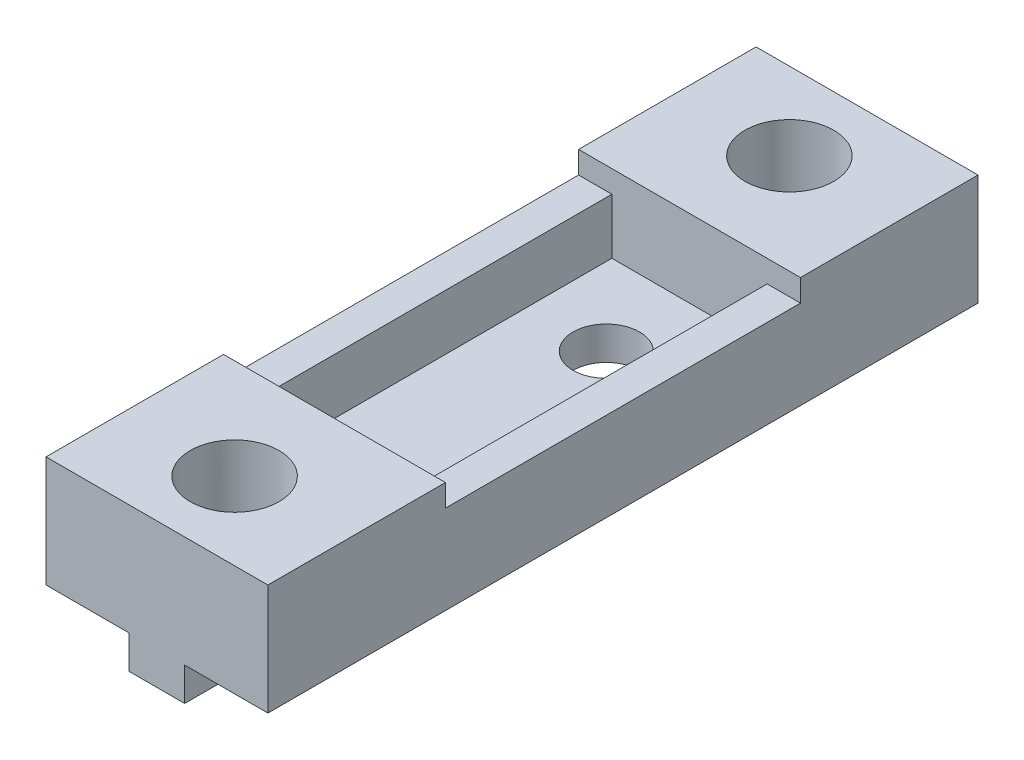
ISO-10303-21;
HEADER;
FILE_DESCRIPTION(('STEP AP214'),'2;1');
FILE_NAME('part.step','',(''),(''),'','','');
FILE_SCHEMA(('AUTOMOTIVE_DESIGN { 1 0 10303 214 1 1 1 1 }'));
ENDSEC;
DATA;
#1=APPLICATION_CONTEXT('core data for automotive mechanical design processes');
#2=APPLICATION_PROTOCOL_DEFINITION('international standard','automotive_design',2000,#1);
#3=PRODUCT_CONTEXT('',#1,'mechanical');
#4=PRODUCT('Part','Part','',(#3));
#5=PRODUCT_RELATED_PRODUCT_CATEGORY('part','',(#4));
#6=PRODUCT_DEFINITION_FORMATION('','',#4);
#7=PRODUCT_DEFINITION_CONTEXT('part definition',#1,'design');
#8=PRODUCT_DEFINITION('design','',#6,#7);
#9=PRODUCT_DEFINITION_SHAPE('','',#8);
#10=(LENGTH_UNIT() NAMED_UNIT(*) SI_UNIT(.MILLI.,.METRE.));
#11=(NAMED_UNIT(*) PLANE_ANGLE_UNIT() SI_UNIT($,.RADIAN.));
#12=(NAMED_UNIT(*) SI_UNIT($,.STERADIAN.) SOLID_ANGLE_UNIT());
#13=UNCERTAINTY_MEASURE_WITH_UNIT(LENGTH_MEASURE(1.E-05),#10,'distance_accuracy_value','');
#14=(GEOMETRIC_REPRESENTATION_CONTEXT(3) GLOBAL_UNCERTAINTY_ASSIGNED_CONTEXT((#13)) GLOBAL_UNIT_ASSIGNED_CONTEXT((#10,
#11,#12)) REPRESENTATION_CONTEXT('',''));
#15=CARTESIAN_POINT('',(0.,0.,0.));
#16=DIRECTION('',(0.,0.,1.));
#17=DIRECTION('',(1.,0.,0.));
#18=AXIS2_PLACEMENT_3D('',#15,#16,#17);
#19=CARTESIAN_POINT('',(0.,3.,0.));
#20=DIRECTION('',(0.,-1.,0.));
#21=DIRECTION('',(0.,0.,-1.));
#22=AXIS2_PLACEMENT_3D('',#19,#20,#21);
#23=PLANE('',#22);
#24=CARTESIAN_POINT('',(0.,3.,8.5));
#25=DIRECTION('',(0.,-1.,0.));
#26=DIRECTION('',(0.,0.,-1.));
#27=AXIS2_PLACEMENT_3D('',#24,#25,#26);
#28=CIRCLE('',#27,3.);
#29=CARTESIAN_POINT('',(0.,3.,5.5));
#30=VERTEX_POINT('',#29);
#31=EDGE_CURVE('E356',#30,#30,#28,.T.);
#32=ORIENTED_EDGE('',*,*,#31,.T.);
#33=EDGE_LOOP('',(#32));
#34=FACE_BOUND('',#33,.T.);
#35=DIRECTION('',(0.,0.,-1.));
#36=VECTOR('',#35,1.);
#37=CARTESIAN_POINT('',(-7.,3.,0.));
#38=LINE('',#37,#36);
#39=CARTESIAN_POINT('',(-7.,3.,33.));
#40=VERTEX_POINT('',#39);
#41=CARTESIAN_POINT('',(-7.,3.,0.999999999999997));
#42=VERTEX_POINT('',#41);
#43=EDGE_CURVE('E204',#40,#42,#38,.T.);
#44=ORIENTED_EDGE('',*,*,#43,.F.);
#45=DIRECTION('',(1.,0.,0.));
#46=VECTOR('',#45,1.);
#47=CARTESIAN_POINT('',(0.,3.,33.));
#48=LINE('',#47,#46);
#49=CARTESIAN_POINT('',(7.,3.,33.));
#50=VERTEX_POINT('',#49);
#51=EDGE_CURVE('E186',#40,#50,#48,.T.);
#52=ORIENTED_EDGE('',*,*,#51,.T.);
#53=DIRECTION('',(0.,0.,-1.));
#54=VECTOR('',#53,1.);
#55=CARTESIAN_POINT('',(7.,3.,0.));
#56=LINE('',#55,#54);
#57=CARTESIAN_POINT('',(7.,3.,0.999999999999997));
#58=VERTEX_POINT('',#57);
#59=EDGE_CURVE('E190',#50,#58,#56,.T.);
#60=ORIENTED_EDGE('',*,*,#59,.T.);
#61=DIRECTION('',(1.,0.,0.));
#62=VECTOR('',#61,1.);
#63=CARTESIAN_POINT('',(0.,3.,0.999999999999997));
#64=LINE('',#63,#62);
#65=EDGE_CURVE('E332',#42,#58,#64,.T.);
#66=ORIENTED_EDGE('',*,*,#65,.F.);
#67=EDGE_LOOP('',(#44,#52,#60,#66));
#68=FACE_BOUND('',#67,.T.);
#69=ADVANCED_FACE('F41',(#34,#68),#23,.F.);
#70=CARTESIAN_POINT('',(0.,35.6124969497314,0.999999999999997));
#71=DIRECTION('',(0.,0.,-1.));
#72=DIRECTION('',(-1.,0.,0.));
#73=AXIS2_PLACEMENT_3D('',#70,#71,#72);
#74=PLANE('',#73);
#75=DIRECTION('',(0.,-1.,0.));
#76=VECTOR('',#75,1.);
#77=CARTESIAN_POINT('',(-7.,8.,0.999999999999997));
#78=LINE('',#77,#76);
#79=CARTESIAN_POINT('',(-7.,8.,0.999999999999997));
#80=VERTEX_POINT('',#79);
#81=EDGE_CURVE('E191',#80,#42,#78,.T.);
#82=ORIENTED_EDGE('',*,*,#81,.T.);
#83=ORIENTED_EDGE('',*,*,#65,.T.);
#84=DIRECTION('',(0.,-1.,0.));
#85=VECTOR('',#84,1.);
#86=CARTESIAN_POINT('',(7.,8.,0.999999999999997));
#87=LINE('',#86,#85);
#88=CARTESIAN_POINT('',(7.,8.,0.999999999999997));
#89=VERTEX_POINT('',#88);
#90=EDGE_CURVE('E231',#89,#58,#87,.T.);
#91=ORIENTED_EDGE('',*,*,#90,.F.);
#92=DIRECTION('',(-1.,0.,0.));
#93=VECTOR('',#92,1.);
#94=CARTESIAN_POINT('',(0.,8.,0.999999999999997));
#95=LINE('',#94,#93);
#96=CARTESIAN_POINT('',(10.,8.,0.999999999999997));
#97=VERTEX_POINT('',#96);
#98=EDGE_CURVE('E227',#97,#89,#95,.T.);
#99=ORIENTED_EDGE('',*,*,#98,.F.);
#100=DIRECTION('',(0.,-1.,0.));
#101=VECTOR('',#100,1.);
#102=CARTESIAN_POINT('',(10.,35.6124969497314,0.999999999999997));
#103=LINE('',#102,#101);
#104=CARTESIAN_POINT('',(10.,10.,0.999999999999997));
#105=VERTEX_POINT('',#104);
#106=EDGE_CURVE('E331',#105,#97,#103,.T.);
#107=ORIENTED_EDGE('',*,*,#106,.F.);
#108=DIRECTION('',(1.,0.,0.));
#109=VECTOR('',#108,1.);
#110=CARTESIAN_POINT('',(0.,10.,0.999999999999997));
#111=LINE('',#110,#109);
#112=CARTESIAN_POINT('',(-10.,10.,0.999999999999997));
#113=VERTEX_POINT('',#112);
#114=EDGE_CURVE('E335',#113,#105,#111,.T.);
#115=ORIENTED_EDGE('',*,*,#114,.F.);
#116=DIRECTION('',(0.,-1.,0.));
#117=VECTOR('',#116,1.);
#118=CARTESIAN_POINT('',(-10.,35.6124969497314,0.999999999999997));
#119=LINE('',#118,#117);
#120=CARTESIAN_POINT('',(-10.,8.,0.999999999999997));
#121=VERTEX_POINT('',#120);
#122=EDGE_CURVE('E63',#113,#121,#119,.T.);
#123=ORIENTED_EDGE('',*,*,#122,.T.);
#124=DIRECTION('',(-1.,0.,0.));
#125=VECTOR('',#124,1.);
#126=CARTESIAN_POINT('',(0.,8.,0.999999999999997));
#127=LINE('',#126,#125);
#128=EDGE_CURVE('E58',#80,#121,#127,.T.);
#129=ORIENTED_EDGE('',*,*,#128,.F.);
#130=EDGE_LOOP('',(#82,#83,#91,#99,#107,#115,#123,#129));
#131=FACE_BOUND('',#130,.T.);
#132=ADVANCED_FACE('F476',(#131),#74,.F.);
#133=CARTESIAN_POINT('',(0.,35.6124969497314,33.));
#134=DIRECTION('',(0.,0.,-1.));
#135=DIRECTION('',(-1.,0.,0.));
#136=AXIS2_PLACEMENT_3D('',#133,#134,#135);
#137=PLANE('',#136);
#138=ORIENTED_EDGE('',*,*,#51,.F.);
#139=DIRECTION('',(0.,-1.,0.));
#140=VECTOR('',#139,1.);
#141=CARTESIAN_POINT('',(-7.,8.,33.));
#142=LINE('',#141,#140);
#143=CARTESIAN_POINT('',(-7.,8.,33.));
#144=VERTEX_POINT('',#143);
#145=EDGE_CURVE('E178',#144,#40,#142,.T.);
#146=ORIENTED_EDGE('',*,*,#145,.F.);
#147=DIRECTION('',(1.,0.,0.));
#148=VECTOR('',#147,1.);
#149=CARTESIAN_POINT('',(0.,8.,33.));
#150=LINE('',#149,#148);
#151=CARTESIAN_POINT('',(-10.,8.,33.));
#152=VERTEX_POINT('',#151);
#153=EDGE_CURVE('E183',#152,#144,#150,.T.);
#154=ORIENTED_EDGE('',*,*,#153,.F.);
#155=DIRECTION('',(0.,-1.,0.));
#156=VECTOR('',#155,1.);
#157=CARTESIAN_POINT('',(-10.,35.6124969497314,33.));
#158=LINE('',#157,#156);
#159=CARTESIAN_POINT('',(-10.,10.,33.));
#160=VERTEX_POINT('',#159);
#161=EDGE_CURVE('E279',#160,#152,#158,.T.);
#162=ORIENTED_EDGE('',*,*,#161,.F.);
#163=DIRECTION('',(1.,0.,0.));
#164=VECTOR('',#163,1.);
#165=CARTESIAN_POINT('',(0.,10.,33.));
#166=LINE('',#165,#164);
#167=CARTESIAN_POINT('',(10.,10.,33.));
#168=VERTEX_POINT('',#167);
#169=EDGE_CURVE('E269',#160,#168,#166,.T.);
#170=ORIENTED_EDGE('',*,*,#169,.T.);
#171=DIRECTION('',(0.,-1.,0.));
#172=VECTOR('',#171,1.);
#173=CARTESIAN_POINT('',(10.,35.6124969497314,33.));
#174=LINE('',#173,#172);
#175=CARTESIAN_POINT('',(10.,8.,33.));
#176=VERTEX_POINT('',#175);
#177=EDGE_CURVE('E282',#168,#176,#174,.T.);
#178=ORIENTED_EDGE('',*,*,#177,.T.);
#179=DIRECTION('',(1.,0.,0.));
#180=VECTOR('',#179,1.);
#181=CARTESIAN_POINT('',(0.,8.,33.));
#182=LINE('',#181,#180);
#183=CARTESIAN_POINT('',(7.,8.,33.));
#184=VERTEX_POINT('',#183);
#185=EDGE_CURVE('E219',#184,#176,#182,.T.);
#186=ORIENTED_EDGE('',*,*,#185,.F.);
#187=DIRECTION('',(0.,-1.,0.));
#188=VECTOR('',#187,1.);
#189=CARTESIAN_POINT('',(7.,8.,33.));
#190=LINE('',#189,#188);
#191=EDGE_CURVE('E238',#184,#50,#190,.T.);
#192=ORIENTED_EDGE('',*,*,#191,.T.);
#193=EDGE_LOOP('',(#138,#146,#154,#162,#170,#178,#186,#192));
#194=FACE_BOUND('',#193,.T.);
#195=ADVANCED_FACE('F180',(#194),#137,.T.);
#196=CARTESIAN_POINT('',(0.,0.,0.));
#197=DIRECTION('',(0.,-1.,0.));
#198=DIRECTION('',(0.,0.,-1.));
#199=AXIS2_PLACEMENT_3D('',#196,#197,#198);
#200=PLANE('',#199);
#201=CARTESIAN_POINT('',(0.,0.,8.5));
#202=DIRECTION('',(0.,-1.,0.));
#203=DIRECTION('',(0.,0.,-1.));
#204=AXIS2_PLACEMENT_3D('',#201,#202,#203);
#205=CIRCLE('',#204,3.);
#206=CARTESIAN_POINT('',(0.,0.,5.5));
#207=VERTEX_POINT('',#206);
#208=EDGE_CURVE('E45',#207,#207,#205,.T.);
#209=ORIENTED_EDGE('',*,*,#208,.F.);
#210=EDGE_LOOP('',(#209));
#211=FACE_BOUND('',#210,.T.);
#212=DIRECTION('',(1.,0.,0.));
#213=VECTOR('',#212,1.);
#214=CARTESIAN_POINT('',(-2.5,0.,25.));
#215=LINE('',#214,#213);
#216=CARTESIAN_POINT('',(-2.5,0.,25.));
#217=VERTEX_POINT('',#216);
#218=CARTESIAN_POINT('',(2.5,0.,25.));
#219=VERTEX_POINT('',#218);
#220=EDGE_CURVE('E253',#217,#219,#215,.T.);
#221=ORIENTED_EDGE('',*,*,#220,.F.);
#222=DIRECTION('',(0.,0.,1.));
#223=VECTOR('',#222,1.);
#224=CARTESIAN_POINT('',(-2.5,0.,49.));
#225=LINE('',#224,#223);
#226=CARTESIAN_POINT('',(-2.5,0.,49.));
#227=VERTEX_POINT('',#226);
#228=EDGE_CURVE('E298',#217,#227,#225,.T.);
#229=ORIENTED_EDGE('',*,*,#228,.T.);
#230=DIRECTION('',(-1.,0.,0.));
#231=VECTOR('',#230,1.);
#232=CARTESIAN_POINT('',(-10.,0.,49.));
#233=LINE('',#232,#231);
#234=CARTESIAN_POINT('',(-10.,0.,49.));
#235=VERTEX_POINT('',#234);
#236=EDGE_CURVE('E319',#227,#235,#233,.T.);
#237=ORIENTED_EDGE('',*,*,#236,.T.);
#238=DIRECTION('',(0.,0.,1.));
#239=VECTOR('',#238,1.);
#240=CARTESIAN_POINT('',(-10.,0.,15.));
#241=LINE('',#240,#239);
#242=CARTESIAN_POINT('',(-10.,0.,-15.));
#243=VERTEX_POINT('',#242);
#244=EDGE_CURVE('E413',#243,#235,#241,.T.);
#245=ORIENTED_EDGE('',*,*,#244,.F.);
#246=DIRECTION('',(-1.,0.,0.));
#247=VECTOR('',#246,1.);
#248=CARTESIAN_POINT('',(-10.,0.,-15.));
#249=LINE('',#248,#247);
#250=CARTESIAN_POINT('',(-2.5,0.,-15.));
#251=VERTEX_POINT('',#250);
#252=EDGE_CURVE('E408',#251,#243,#249,.T.);
#253=ORIENTED_EDGE('',*,*,#252,.F.);
#254=DIRECTION('',(0.,0.,-1.));
#255=VECTOR('',#254,1.);
#256=CARTESIAN_POINT('',(-2.5,0.,-15.));
#257=LINE('',#256,#255);
#258=CARTESIAN_POINT('',(-2.5,0.,-3.));
#259=VERTEX_POINT('',#258);
#260=EDGE_CURVE('E370',#259,#251,#257,.T.);
#261=ORIENTED_EDGE('',*,*,#260,.F.);
#262=DIRECTION('',(-1.,0.,0.));
#263=VECTOR('',#262,1.);
#264=CARTESIAN_POINT('',(-2.5,0.,-3.));
#265=LINE('',#264,#263);
#266=CARTESIAN_POINT('',(2.5,0.,-3.));
#267=VERTEX_POINT('',#266);
#268=EDGE_CURVE('E383',#267,#259,#265,.T.);
#269=ORIENTED_EDGE('',*,*,#268,.F.);
#270=DIRECTION('',(0.,0.,1.));
#271=VECTOR('',#270,1.);
#272=CARTESIAN_POINT('',(2.5,0.,-15.));
#273=LINE('',#272,#271);
#274=CARTESIAN_POINT('',(2.5,0.,-15.));
#275=VERTEX_POINT('',#274);
#276=EDGE_CURVE('E364',#275,#267,#273,.T.);
#277=ORIENTED_EDGE('',*,*,#276,.F.);
#278=CARTESIAN_POINT('',(10.,0.,-15.));
#279=VERTEX_POINT('',#278);
#280=EDGE_CURVE('E409',#279,#275,#249,.T.);
#281=ORIENTED_EDGE('',*,*,#280,.F.);
#282=DIRECTION('',(0.,0.,-1.));
#283=VECTOR('',#282,1.);
#284=CARTESIAN_POINT('',(10.,0.,15.));
#285=LINE('',#284,#283);
#286=CARTESIAN_POINT('',(10.,0.,49.));
#287=VERTEX_POINT('',#286);
#288=EDGE_CURVE('E405',#287,#279,#285,.T.);
#289=ORIENTED_EDGE('',*,*,#288,.F.);
#290=CARTESIAN_POINT('',(2.5,0.,49.));
#291=VERTEX_POINT('',#290);
#292=EDGE_CURVE('E320',#287,#291,#233,.T.);
#293=ORIENTED_EDGE('',*,*,#292,.T.);
#294=DIRECTION('',(0.,0.,-1.));
#295=VECTOR('',#294,1.);
#296=CARTESIAN_POINT('',(2.5,0.,49.));
#297=LINE('',#296,#295);
#298=EDGE_CURVE('E293',#291,#219,#297,.T.);
#299=ORIENTED_EDGE('',*,*,#298,.T.);
#300=EDGE_LOOP('',(#221,#229,#237,#245,#253,#261,#269,#277,#281,#289,#293,#299));
#301=FACE_BOUND('',#300,.T.);
#302=ADVANCED_FACE('F427',(#211,#301),#200,.T.);
#303=CARTESIAN_POINT('',(10.,3.,15.));
#304=DIRECTION('',(-1.,0.,0.));
#305=DIRECTION('',(0.,0.,1.));
#306=AXIS2_PLACEMENT_3D('',#303,#304,#305);
#307=PLANE('',#306);
#308=ORIENTED_EDGE('',*,*,#106,.T.);
#309=DIRECTION('',(0.,0.,-1.));
#310=VECTOR('',#309,1.);
#311=CARTESIAN_POINT('',(10.,8.,0.));
#312=LINE('',#311,#310);
#313=EDGE_CURVE('E223',#176,#97,#312,.T.);
#314=ORIENTED_EDGE('',*,*,#313,.F.);
#315=ORIENTED_EDGE('',*,*,#177,.F.);
#316=DIRECTION('',(0.,0.,1.));
#317=VECTOR('',#316,1.);
#318=CARTESIAN_POINT('',(10.,10.,34.));
#319=LINE('',#318,#317);
#320=CARTESIAN_POINT('',(10.,10.,49.));
#321=VERTEX_POINT('',#320);
#322=EDGE_CURVE('E273',#168,#321,#319,.T.);
#323=ORIENTED_EDGE('',*,*,#322,.T.);
#324=DIRECTION('',(0.,-1.,0.));
#325=VECTOR('',#324,1.);
#326=CARTESIAN_POINT('',(10.,3.,49.));
#327=LINE('',#326,#325);
#328=EDGE_CURVE('E323',#321,#287,#327,.T.);
#329=ORIENTED_EDGE('',*,*,#328,.T.);
#330=ORIENTED_EDGE('',*,*,#288,.T.);
#331=DIRECTION('',(0.,-1.,0.));
#332=VECTOR('',#331,1.);
#333=CARTESIAN_POINT('',(10.,3.,-15.));
#334=LINE('',#333,#332);
#335=CARTESIAN_POINT('',(10.,10.,-15.));
#336=VERTEX_POINT('',#335);
#337=EDGE_CURVE('E11',#336,#279,#334,.T.);
#338=ORIENTED_EDGE('',*,*,#337,.F.);
#339=DIRECTION('',(0.,0.,-1.));
#340=VECTOR('',#339,1.);
#341=CARTESIAN_POINT('',(10.,10.,0.));
#342=LINE('',#341,#340);
#343=EDGE_CURVE('E344',#105,#336,#342,.T.);
#344=ORIENTED_EDGE('',*,*,#343,.F.);
#345=EDGE_LOOP('',(#308,#314,#315,#323,#329,#330,#338,#344));
#346=FACE_BOUND('',#345,.T.);
#347=ADVANCED_FACE('F43',(#346),#307,.F.);
#348=CARTESIAN_POINT('',(-10.,3.,-15.));
#349=DIRECTION('',(0.,0.,1.));
#350=DIRECTION('',(1.,0.,0.));
#351=AXIS2_PLACEMENT_3D('',#348,#349,#350);
#352=PLANE('',#351);
#353=ORIENTED_EDGE('',*,*,#280,.T.);
#354=DIRECTION('',(0.,1.,0.));
#355=VECTOR('',#354,1.);
#356=CARTESIAN_POINT('',(2.5,-3.,-15.));
#357=LINE('',#356,#355);
#358=CARTESIAN_POINT('',(2.5,-3.,-15.));
#359=VERTEX_POINT('',#358);
#360=EDGE_CURVE('E379',#359,#275,#357,.T.);
#361=ORIENTED_EDGE('',*,*,#360,.F.);
#362=DIRECTION('',(1.,0.,0.));
#363=VECTOR('',#362,1.);
#364=CARTESIAN_POINT('',(-2.5,-3.,-15.));
#365=LINE('',#364,#363);
#366=CARTESIAN_POINT('',(-2.5,-3.,-15.));
#367=VERTEX_POINT('',#366);
#368=EDGE_CURVE('E376',#367,#359,#365,.T.);
#369=ORIENTED_EDGE('',*,*,#368,.F.);
#370=DIRECTION('',(0.,1.,0.));
#371=VECTOR('',#370,1.);
#372=CARTESIAN_POINT('',(-2.5,-3.,-15.));
#373=LINE('',#372,#371);
#374=EDGE_CURVE('E393',#367,#251,#373,.T.);
#375=ORIENTED_EDGE('',*,*,#374,.T.);
#376=ORIENTED_EDGE('',*,*,#252,.T.);
#377=DIRECTION('',(0.,-1.,0.));
#378=VECTOR('',#377,1.);
#379=CARTESIAN_POINT('',(-10.,3.,-15.));
#380=LINE('',#379,#378);
#381=CARTESIAN_POINT('',(-10.,10.,-15.));
#382=VERTEX_POINT('',#381);
#383=EDGE_CURVE('E51',#382,#243,#380,.T.);
#384=ORIENTED_EDGE('',*,*,#383,.F.);
#385=DIRECTION('',(-1.,0.,0.));
#386=VECTOR('',#385,1.);
#387=CARTESIAN_POINT('',(0.,10.,-15.));
#388=LINE('',#387,#386);
#389=EDGE_CURVE('E340',#336,#382,#388,.T.);
#390=ORIENTED_EDGE('',*,*,#389,.F.);
#391=ORIENTED_EDGE('',*,*,#337,.T.);
#392=EDGE_LOOP('',(#353,#361,#369,#375,#376,#384,#390,#391));
#393=FACE_BOUND('',#392,.T.);
#394=ADVANCED_FACE('F433',(#393),#352,.F.);
#395=CARTESIAN_POINT('',(-10.,3.,15.));
#396=DIRECTION('',(1.,0.,0.));
#397=DIRECTION('',(0.,0.,-1.));
#398=AXIS2_PLACEMENT_3D('',#395,#396,#397);
#399=PLANE('',#398);
#400=ORIENTED_EDGE('',*,*,#244,.T.);
#401=DIRECTION('',(0.,-1.,0.));
#402=VECTOR('',#401,1.);
#403=CARTESIAN_POINT('',(-10.,3.,49.));
#404=LINE('',#403,#402);
#405=CARTESIAN_POINT('',(-10.,10.,49.));
#406=VERTEX_POINT('',#405);
#407=EDGE_CURVE('E327',#406,#235,#404,.T.);
#408=ORIENTED_EDGE('',*,*,#407,.F.);
#409=DIRECTION('',(0.,0.,-1.));
#410=VECTOR('',#409,1.);
#411=CARTESIAN_POINT('',(-10.,10.,34.));
#412=LINE('',#411,#410);
#413=EDGE_CURVE('E265',#406,#160,#412,.T.);
#414=ORIENTED_EDGE('',*,*,#413,.T.);
#415=ORIENTED_EDGE('',*,*,#161,.T.);
#416=DIRECTION('',(0.,0.,1.));
#417=VECTOR('',#416,1.);
#418=CARTESIAN_POINT('',(-10.,8.,0.));
#419=LINE('',#418,#417);
#420=EDGE_CURVE('E202',#121,#152,#419,.T.);
#421=ORIENTED_EDGE('',*,*,#420,.F.);
#422=ORIENTED_EDGE('',*,*,#122,.F.);
#423=DIRECTION('',(0.,0.,1.));
#424=VECTOR('',#423,1.);
#425=CARTESIAN_POINT('',(-10.,10.,0.));
#426=LINE('',#425,#424);
#427=EDGE_CURVE('E336',#382,#113,#426,.T.);
#428=ORIENTED_EDGE('',*,*,#427,.F.);
#429=ORIENTED_EDGE('',*,*,#383,.T.);
#430=EDGE_LOOP('',(#400,#408,#414,#415,#421,#422,#428,#429));
#431=FACE_BOUND('',#430,.T.);
#432=ADVANCED_FACE('F422',(#431),#399,.F.);
#433=CARTESIAN_POINT('',(2.5,-3.,-15.));
#434=DIRECTION('',(-1.,0.,0.));
#435=DIRECTION('',(0.,0.,1.));
#436=AXIS2_PLACEMENT_3D('',#433,#434,#435);
#437=PLANE('',#436);
#438=ORIENTED_EDGE('',*,*,#276,.T.);
#439=DIRECTION('',(0.,1.,0.));
#440=VECTOR('',#439,1.);
#441=CARTESIAN_POINT('',(2.5,-3.,-3.));
#442=LINE('',#441,#440);
#443=CARTESIAN_POINT('',(2.5,-3.,-3.));
#444=VERTEX_POINT('',#443);
#445=EDGE_CURVE('E401',#444,#267,#442,.T.);
#446=ORIENTED_EDGE('',*,*,#445,.F.);
#447=DIRECTION('',(0.,0.,1.));
#448=VECTOR('',#447,1.);
#449=CARTESIAN_POINT('',(2.5,-3.,-15.));
#450=LINE('',#449,#448);
#451=EDGE_CURVE('E365',#359,#444,#450,.T.);
#452=ORIENTED_EDGE('',*,*,#451,.F.);
#453=ORIENTED_EDGE('',*,*,#360,.T.);
#454=EDGE_LOOP('',(#438,#446,#452,#453));
#455=FACE_BOUND('',#454,.T.);
#456=ADVANCED_FACE('F446',(#455),#437,.F.);
#457=CARTESIAN_POINT('',(-2.5,-3.,-3.));
#458=DIRECTION('',(0.,0.,-1.));
#459=DIRECTION('',(-1.,0.,0.));
#460=AXIS2_PLACEMENT_3D('',#457,#458,#459);
#461=PLANE('',#460);
#462=ORIENTED_EDGE('',*,*,#268,.T.);
#463=DIRECTION('',(0.,1.,0.));
#464=VECTOR('',#463,1.);
#465=CARTESIAN_POINT('',(-2.5,-3.,-3.));
#466=LINE('',#465,#464);
#467=CARTESIAN_POINT('',(-2.5,-3.,-3.));
#468=VERTEX_POINT('',#467);
#469=EDGE_CURVE('E397',#468,#259,#466,.T.);
#470=ORIENTED_EDGE('',*,*,#469,.F.);
#471=DIRECTION('',(-1.,0.,0.));
#472=VECTOR('',#471,1.);
#473=CARTESIAN_POINT('',(-2.5,-3.,-3.));
#474=LINE('',#473,#472);
#475=EDGE_CURVE('E369',#444,#468,#474,.T.);
#476=ORIENTED_EDGE('',*,*,#475,.F.);
#477=ORIENTED_EDGE('',*,*,#445,.T.);
#478=EDGE_LOOP('',(#462,#470,#476,#477));
#479=FACE_BOUND('',#478,.T.);
#480=ADVANCED_FACE('F442',(#479),#461,.F.);
#481=CARTESIAN_POINT('',(-2.5,-3.,-15.));
#482=DIRECTION('',(1.,0.,0.));
#483=DIRECTION('',(0.,0.,-1.));
#484=AXIS2_PLACEMENT_3D('',#481,#482,#483);
#485=PLANE('',#484);
#486=ORIENTED_EDGE('',*,*,#260,.T.);
#487=ORIENTED_EDGE('',*,*,#374,.F.);
#488=DIRECTION('',(0.,0.,-1.));
#489=VECTOR('',#488,1.);
#490=CARTESIAN_POINT('',(-2.5,-3.,-15.));
#491=LINE('',#490,#489);
#492=EDGE_CURVE('E373',#468,#367,#491,.T.);
#493=ORIENTED_EDGE('',*,*,#492,.F.);
#494=ORIENTED_EDGE('',*,*,#469,.T.);
#495=EDGE_LOOP('',(#486,#487,#493,#494));
#496=FACE_BOUND('',#495,.T.);
#497=ADVANCED_FACE('F439',(#496),#485,.F.);
#498=CARTESIAN_POINT('',(0.,-3.,0.));
#499=DIRECTION('',(0.,1.,0.));
#500=DIRECTION('',(0.,0.,1.));
#501=AXIS2_PLACEMENT_3D('',#498,#499,#500);
#502=PLANE('',#501);
#503=ORIENTED_EDGE('',*,*,#451,.T.);
#504=ORIENTED_EDGE('',*,*,#475,.T.);
#505=ORIENTED_EDGE('',*,*,#492,.T.);
#506=ORIENTED_EDGE('',*,*,#368,.T.);
#507=EDGE_LOOP('',(#503,#504,#505,#506));
#508=FACE_BOUND('',#507,.T.);
#509=ADVANCED_FACE('F716',(#508),#502,.F.);
#510=CARTESIAN_POINT('',(0.,-3.,8.5));
#511=DIRECTION('',(0.,1.,0.));
#512=DIRECTION('',(0.,0.,1.));
#513=AXIS2_PLACEMENT_3D('',#510,#511,#512);
#514=CYLINDRICAL_SURFACE('',#513,3.);
#515=ORIENTED_EDGE('',*,*,#208,.T.);
#516=EDGE_LOOP('',(#515));
#517=FACE_BOUND('',#516,.T.);
#518=ORIENTED_EDGE('',*,*,#31,.F.);
#519=EDGE_LOOP('',(#518));
#520=FACE_BOUND('',#519,.T.);
#521=ADVANCED_FACE('F629',(#517,#520),#514,.F.);
#522=CARTESIAN_POINT('',(0.,10.,-8.));
#523=DIRECTION('',(0.,-1.,0.));
#524=DIRECTION('',(0.,0.,-1.));
#525=AXIS2_PLACEMENT_3D('',#522,#523,#524);
#526=CYLINDRICAL_SURFACE('',#525,4.);
#527=CARTESIAN_POINT('',(0.,10.,-8.));
#528=DIRECTION('',(0.,1.,0.));
#529=DIRECTION('',(0.,0.,1.));
#530=AXIS2_PLACEMENT_3D('',#527,#528,#529);
#531=CIRCLE('',#530,4.);
#532=CARTESIAN_POINT('',(0.,10.,-4.));
#533=VERTEX_POINT('',#532);
#534=EDGE_CURVE('E360',#533,#533,#531,.T.);
#535=ORIENTED_EDGE('',*,*,#534,.T.);
#536=EDGE_LOOP('',(#535));
#537=FACE_BOUND('',#536,.T.);
#538=CARTESIAN_POINT('',(0.,2.5,-8.));
#539=DIRECTION('',(0.,1.,0.));
#540=DIRECTION('',(0.,0.,1.));
#541=AXIS2_PLACEMENT_3D('',#538,#539,#540);
#542=CIRCLE('',#541,4.);
#543=CARTESIAN_POINT('',(0.,2.5,-4.));
#544=VERTEX_POINT('',#543);
#545=EDGE_CURVE('E242',#544,#544,#542,.T.);
#546=ORIENTED_EDGE('',*,*,#545,.F.);
#547=EDGE_LOOP('',(#546));
#548=FACE_BOUND('',#547,.T.);
#549=ADVANCED_FACE('F622',(#537,#548),#526,.F.);
#550=CARTESIAN_POINT('',(0.,10.,-8.));
#551=DIRECTION('',(0.,1.,0.));
#552=DIRECTION('',(0.,0.,1.));
#553=AXIS2_PLACEMENT_3D('',#550,#551,#552);
#554=PLANE('',#553);
#555=ORIENTED_EDGE('',*,*,#389,.T.);
#556=ORIENTED_EDGE('',*,*,#427,.T.);
#557=ORIENTED_EDGE('',*,*,#114,.T.);
#558=ORIENTED_EDGE('',*,*,#343,.T.);
#559=EDGE_LOOP('',(#555,#556,#557,#558));
#560=FACE_BOUND('',#559,.T.);
#561=ORIENTED_EDGE('',*,*,#534,.F.);
#562=EDGE_LOOP('',(#561));
#563=FACE_BOUND('',#562,.T.);
#564=ADVANCED_FACE('F628',(#560,#563),#554,.T.);
#565=CARTESIAN_POINT('',(-10.,3.,49.));
#566=DIRECTION('',(0.,0.,1.));
#567=DIRECTION('',(1.,0.,0.));
#568=AXIS2_PLACEMENT_3D('',#565,#566,#567);
#569=PLANE('',#568);
#570=ORIENTED_EDGE('',*,*,#292,.F.);
#571=ORIENTED_EDGE('',*,*,#328,.F.);
#572=DIRECTION('',(-1.,0.,0.));
#573=VECTOR('',#572,1.);
#574=CARTESIAN_POINT('',(0.,10.,49.));
#575=LINE('',#574,#573);
#576=EDGE_CURVE('E285',#321,#406,#575,.T.);
#577=ORIENTED_EDGE('',*,*,#576,.T.);
#578=ORIENTED_EDGE('',*,*,#407,.T.);
#579=ORIENTED_EDGE('',*,*,#236,.F.);
#580=DIRECTION('',(0.,1.,0.));
#581=VECTOR('',#580,1.);
#582=CARTESIAN_POINT('',(-2.5,-3.,49.));
#583=LINE('',#582,#581);
#584=CARTESIAN_POINT('',(-2.5,-3.,49.));
#585=VERTEX_POINT('',#584);
#586=EDGE_CURVE('E306',#585,#227,#583,.T.);
#587=ORIENTED_EDGE('',*,*,#586,.F.);
#588=DIRECTION('',(1.,0.,0.));
#589=VECTOR('',#588,1.);
#590=CARTESIAN_POINT('',(-2.5,-3.,49.));
#591=LINE('',#590,#589);
#592=CARTESIAN_POINT('',(2.5,-3.,49.));
#593=VERTEX_POINT('',#592);
#594=EDGE_CURVE('E297',#585,#593,#591,.T.);
#595=ORIENTED_EDGE('',*,*,#594,.T.);
#596=DIRECTION('',(0.,1.,0.));
#597=VECTOR('',#596,1.);
#598=CARTESIAN_POINT('',(2.5,-3.,49.));
#599=LINE('',#598,#597);
#600=EDGE_CURVE('E315',#593,#291,#599,.T.);
#601=ORIENTED_EDGE('',*,*,#600,.T.);
#602=EDGE_LOOP('',(#570,#571,#577,#578,#579,#587,#595,#601));
#603=FACE_BOUND('',#602,.T.);
#604=ADVANCED_FACE('F452',(#603),#569,.T.);
#605=CARTESIAN_POINT('',(2.5,-3.,49.));
#606=DIRECTION('',(1.,0.,0.));
#607=DIRECTION('',(0.,0.,-1.));
#608=AXIS2_PLACEMENT_3D('',#605,#606,#607);
#609=PLANE('',#608);
#610=ORIENTED_EDGE('',*,*,#298,.F.);
#611=ORIENTED_EDGE('',*,*,#600,.F.);
#612=DIRECTION('',(0.,0.,-1.));
#613=VECTOR('',#612,1.);
#614=CARTESIAN_POINT('',(2.5,-3.,49.));
#615=LINE('',#614,#613);
#616=CARTESIAN_POINT('',(2.5,-3.,25.));
#617=VERTEX_POINT('',#616);
#618=EDGE_CURVE('E294',#593,#617,#615,.T.);
#619=ORIENTED_EDGE('',*,*,#618,.T.);
#620=DIRECTION('',(0.,-1.,0.));
#621=VECTOR('',#620,1.);
#622=CARTESIAN_POINT('',(2.5,0.,25.));
#623=LINE('',#622,#621);
#624=EDGE_CURVE('E257',#219,#617,#623,.T.);
#625=ORIENTED_EDGE('',*,*,#624,.F.);
#626=EDGE_LOOP('',(#610,#611,#619,#625));
#627=FACE_BOUND('',#626,.T.);
#628=ADVANCED_FACE('F457',(#627),#609,.T.);
#629=CARTESIAN_POINT('',(-2.5,-3.,49.));
#630=DIRECTION('',(-1.,0.,0.));
#631=DIRECTION('',(0.,0.,1.));
#632=AXIS2_PLACEMENT_3D('',#629,#630,#631);
#633=PLANE('',#632);
#634=ORIENTED_EDGE('',*,*,#228,.F.);
#635=DIRECTION('',(0.,1.,0.));
#636=VECTOR('',#635,1.);
#637=CARTESIAN_POINT('',(-2.5,-3.,25.));
#638=LINE('',#637,#636);
#639=CARTESIAN_POINT('',(-2.5,-3.,25.));
#640=VERTEX_POINT('',#639);
#641=EDGE_CURVE('E246',#640,#217,#638,.T.);
#642=ORIENTED_EDGE('',*,*,#641,.F.);
#643=DIRECTION('',(0.,0.,1.));
#644=VECTOR('',#643,1.);
#645=CARTESIAN_POINT('',(-2.5,-3.,49.));
#646=LINE('',#645,#644);
#647=EDGE_CURVE('E302',#640,#585,#646,.T.);
#648=ORIENTED_EDGE('',*,*,#647,.T.);
#649=ORIENTED_EDGE('',*,*,#586,.T.);
#650=EDGE_LOOP('',(#634,#642,#648,#649));
#651=FACE_BOUND('',#650,.T.);
#652=ADVANCED_FACE('F465',(#651),#633,.T.);
#653=CARTESIAN_POINT('',(0.,-3.,34.));
#654=DIRECTION('',(0.,1.,0.));
#655=DIRECTION('',(0.,0.,-1.));
#656=AXIS2_PLACEMENT_3D('',#653,#654,#655);
#657=PLANE('',#656);
#658=ORIENTED_EDGE('',*,*,#618,.F.);
#659=ORIENTED_EDGE('',*,*,#594,.F.);
#660=ORIENTED_EDGE('',*,*,#647,.F.);
#661=DIRECTION('',(-1.,0.,0.));
#662=VECTOR('',#661,1.);
#663=CARTESIAN_POINT('',(2.5,-3.,25.));
#664=LINE('',#663,#662);
#665=EDGE_CURVE('E261',#617,#640,#664,.T.);
#666=ORIENTED_EDGE('',*,*,#665,.F.);
#667=EDGE_LOOP('',(#658,#659,#660,#666));
#668=FACE_BOUND('',#667,.T.);
#669=ADVANCED_FACE('F463',(#668),#657,.F.);
#670=CARTESIAN_POINT('',(0.,10.,42.));
#671=DIRECTION('',(0.,-1.,0.));
#672=DIRECTION('',(0.,0.,-1.));
#673=AXIS2_PLACEMENT_3D('',#670,#671,#672);
#674=CYLINDRICAL_SURFACE('',#673,4.);
#675=CARTESIAN_POINT('',(0.,10.,42.));
#676=DIRECTION('',(0.,-1.,0.));
#677=DIRECTION('',(0.,0.,-1.));
#678=AXIS2_PLACEMENT_3D('',#675,#676,#677);
#679=CIRCLE('',#678,4.);
#680=CARTESIAN_POINT('',(0.,10.,38.));
#681=VERTEX_POINT('',#680);
#682=EDGE_CURVE('E289',#681,#681,#679,.T.);
#683=ORIENTED_EDGE('',*,*,#682,.F.);
#684=EDGE_LOOP('',(#683));
#685=FACE_BOUND('',#684,.T.);
#686=CARTESIAN_POINT('',(0.,2.5,42.));
#687=DIRECTION('',(0.,1.,0.));
#688=DIRECTION('',(0.,0.,1.));
#689=AXIS2_PLACEMENT_3D('',#686,#687,#688);
#690=CIRCLE('',#689,4.);
#691=CARTESIAN_POINT('',(0.,2.5,46.));
#692=VERTEX_POINT('',#691);
#693=EDGE_CURVE('E241',#692,#692,#690,.T.);
#694=ORIENTED_EDGE('',*,*,#693,.F.);
#695=EDGE_LOOP('',(#694));
#696=FACE_BOUND('',#695,.T.);
#697=ADVANCED_FACE('F472',(#685,#696),#674,.F.);
#698=CARTESIAN_POINT('',(0.,10.,42.));
#699=DIRECTION('',(0.,1.,0.));
#700=DIRECTION('',(0.,0.,-1.));
#701=AXIS2_PLACEMENT_3D('',#698,#699,#700);
#702=PLANE('',#701);
#703=ORIENTED_EDGE('',*,*,#682,.T.);
#704=EDGE_LOOP('',(#703));
#705=FACE_BOUND('',#704,.T.);
#706=ORIENTED_EDGE('',*,*,#413,.F.);
#707=ORIENTED_EDGE('',*,*,#576,.F.);
#708=ORIENTED_EDGE('',*,*,#322,.F.);
#709=ORIENTED_EDGE('',*,*,#169,.F.);
#710=EDGE_LOOP('',(#706,#707,#708,#709));
#711=FACE_BOUND('',#710,.T.);
#712=ADVANCED_FACE('F614',(#705,#711),#702,.T.);
#713=CARTESIAN_POINT('',(0.,0.,25.));
#714=DIRECTION('',(0.,0.,-1.));
#715=DIRECTION('',(-1.,0.,0.));
#716=AXIS2_PLACEMENT_3D('',#713,#714,#715);
#717=PLANE('',#716);
#718=ORIENTED_EDGE('',*,*,#641,.T.);
#719=ORIENTED_EDGE('',*,*,#220,.T.);
#720=ORIENTED_EDGE('',*,*,#624,.T.);
#721=ORIENTED_EDGE('',*,*,#665,.T.);
#722=EDGE_LOOP('',(#718,#719,#720,#721));
#723=FACE_BOUND('',#722,.T.);
#724=ADVANCED_FACE('F460',(#723),#717,.T.);
#725=CARTESIAN_POINT('',(0.,2.5,42.));
#726=DIRECTION('',(0.,1.,0.));
#727=DIRECTION('',(0.,0.,1.));
#728=AXIS2_PLACEMENT_3D('',#725,#726,#727);
#729=PLANE('',#728);
#730=ORIENTED_EDGE('',*,*,#693,.T.);
#731=EDGE_LOOP('',(#730));
#732=FACE_BOUND('',#731,.T.);
#733=ADVANCED_FACE('F596',(#732),#729,.T.);
#734=CARTESIAN_POINT('',(0.,2.5,-8.));
#735=DIRECTION('',(0.,1.,0.));
#736=DIRECTION('',(0.,0.,1.));
#737=AXIS2_PLACEMENT_3D('',#734,#735,#736);
#738=PLANE('',#737);
#739=ORIENTED_EDGE('',*,*,#545,.T.);
#740=EDGE_LOOP('',(#739));
#741=FACE_BOUND('',#740,.T.);
#742=ADVANCED_FACE('F516',(#741),#738,.T.);
#743=CARTESIAN_POINT('',(7.,8.,0.));
#744=DIRECTION('',(-1.,0.,0.));
#745=DIRECTION('',(0.,0.,1.));
#746=AXIS2_PLACEMENT_3D('',#743,#744,#745);
#747=PLANE('',#746);
#748=ORIENTED_EDGE('',*,*,#59,.F.);
#749=ORIENTED_EDGE('',*,*,#191,.F.);
#750=DIRECTION('',(0.,0.,-1.));
#751=VECTOR('',#750,1.);
#752=CARTESIAN_POINT('',(7.,8.,0.));
#753=LINE('',#752,#751);
#754=EDGE_CURVE('E215',#184,#89,#753,.T.);
#755=ORIENTED_EDGE('',*,*,#754,.T.);
#756=ORIENTED_EDGE('',*,*,#90,.T.);
#757=EDGE_LOOP('',(#748,#749,#755,#756));
#758=FACE_BOUND('',#757,.T.);
#759=ADVANCED_FACE('F512',(#758),#747,.T.);
#760=CARTESIAN_POINT('',(0.,8.,0.));
#761=DIRECTION('',(0.,1.,0.));
#762=DIRECTION('',(0.,0.,1.));
#763=AXIS2_PLACEMENT_3D('',#760,#761,#762);
#764=PLANE('',#763);
#765=ORIENTED_EDGE('',*,*,#754,.F.);
#766=ORIENTED_EDGE('',*,*,#185,.T.);
#767=ORIENTED_EDGE('',*,*,#313,.T.);
#768=ORIENTED_EDGE('',*,*,#98,.T.);
#769=EDGE_LOOP('',(#765,#766,#767,#768));
#770=FACE_BOUND('',#769,.T.);
#771=ADVANCED_FACE('F515',(#770),#764,.T.);
#772=CARTESIAN_POINT('',(-7.,8.,0.));
#773=DIRECTION('',(-1.,0.,0.));
#774=DIRECTION('',(0.,0.,1.));
#775=AXIS2_PLACEMENT_3D('',#772,#773,#774);
#776=PLANE('',#775);
#777=ORIENTED_EDGE('',*,*,#43,.T.);
#778=ORIENTED_EDGE('',*,*,#81,.F.);
#779=DIRECTION('',(0.,0.,-1.));
#780=VECTOR('',#779,1.);
#781=CARTESIAN_POINT('',(-7.,8.,0.));
#782=LINE('',#781,#780);
#783=EDGE_CURVE('E194',#144,#80,#782,.T.);
#784=ORIENTED_EDGE('',*,*,#783,.F.);
#785=ORIENTED_EDGE('',*,*,#145,.T.);
#786=EDGE_LOOP('',(#777,#778,#784,#785));
#787=FACE_BOUND('',#786,.T.);
#788=ADVANCED_FACE('F195',(#787),#776,.F.);
#789=CARTESIAN_POINT('',(0.,8.,0.));
#790=DIRECTION('',(0.,1.,0.));
#791=DIRECTION('',(0.,0.,1.));
#792=AXIS2_PLACEMENT_3D('',#789,#790,#791);
#793=PLANE('',#792);
#794=ORIENTED_EDGE('',*,*,#153,.T.);
#795=ORIENTED_EDGE('',*,*,#783,.T.);
#796=ORIENTED_EDGE('',*,*,#128,.T.);
#797=ORIENTED_EDGE('',*,*,#420,.T.);
#798=EDGE_LOOP('',(#794,#795,#796,#797));
#799=FACE_BOUND('',#798,.T.);
#800=ADVANCED_FACE('F200',(#799),#793,.T.);
#801=CLOSED_SHELL('',(#69,#132,#195,#302,#347,#394,#432,#456,#480,#497,#509,#521,#549,#564,#604,
#628,#652,#669,#697,#712,#724,#733,#742,#759,#771,#788,#800));
#802=MANIFOLD_SOLID_BREP('B2',#801);
#803=ADVANCED_BREP_SHAPE_REPRESENTATION('',(#18,#802),#14);
#804=SHAPE_DEFINITION_REPRESENTATION(#9,#803);
ENDSEC;
END-ISO-10303-21;
